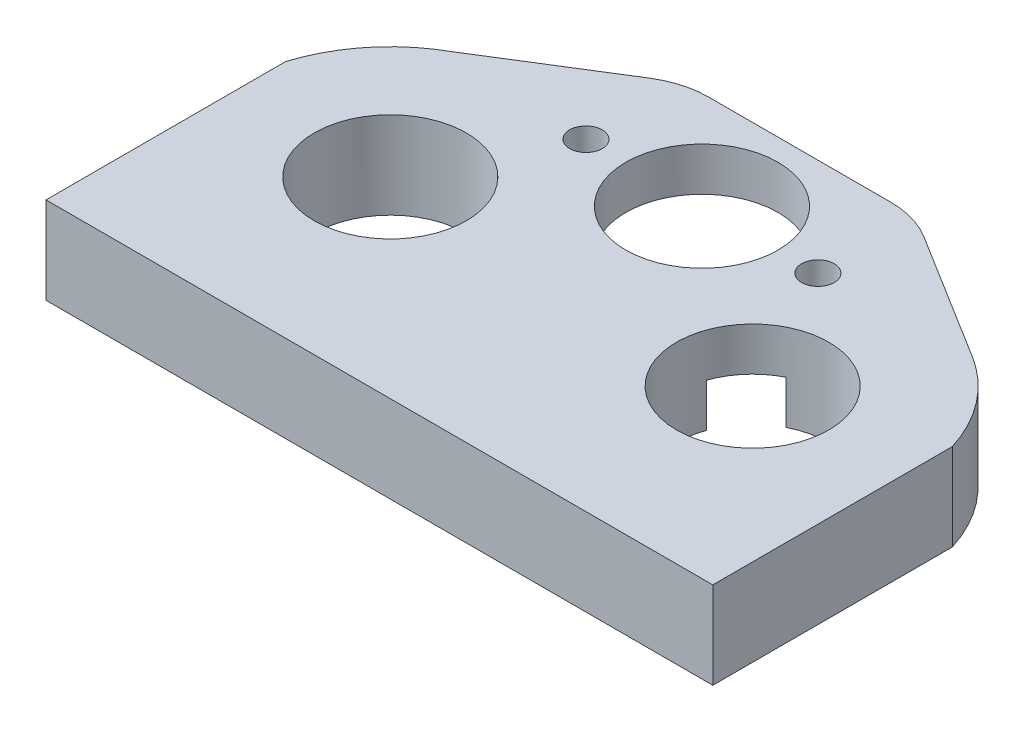
ISO-10303-21;
HEADER;
FILE_DESCRIPTION(('STEP AP214'),'2;1');
FILE_NAME('part.step','',(''),(''),'','','');
FILE_SCHEMA(('AUTOMOTIVE_DESIGN { 1 0 10303 214 1 1 1 1 }'));
ENDSEC;
DATA;
#1=APPLICATION_CONTEXT('core data for automotive mechanical design processes');
#2=APPLICATION_PROTOCOL_DEFINITION('international standard','automotive_design',2000,#1);
#3=PRODUCT_CONTEXT('',#1,'mechanical');
#4=PRODUCT('Part','Part','',(#3));
#5=PRODUCT_RELATED_PRODUCT_CATEGORY('part','',(#4));
#6=PRODUCT_DEFINITION_FORMATION('','',#4);
#7=PRODUCT_DEFINITION_CONTEXT('part definition',#1,'design');
#8=PRODUCT_DEFINITION('design','',#6,#7);
#9=PRODUCT_DEFINITION_SHAPE('','',#8);
#10=(LENGTH_UNIT() NAMED_UNIT(*) SI_UNIT(.MILLI.,.METRE.));
#11=(NAMED_UNIT(*) PLANE_ANGLE_UNIT() SI_UNIT($,.RADIAN.));
#12=(NAMED_UNIT(*) SI_UNIT($,.STERADIAN.) SOLID_ANGLE_UNIT());
#13=UNCERTAINTY_MEASURE_WITH_UNIT(LENGTH_MEASURE(1.E-05),#10,'distance_accuracy_value','');
#14=(GEOMETRIC_REPRESENTATION_CONTEXT(3) GLOBAL_UNCERTAINTY_ASSIGNED_CONTEXT((#13)) GLOBAL_UNIT_ASSIGNED_CONTEXT((#10,
#11,#12)) REPRESENTATION_CONTEXT('',''));
#15=CARTESIAN_POINT('',(0.,0.,0.));
#16=DIRECTION('',(0.,0.,1.));
#17=DIRECTION('',(1.,0.,0.));
#18=AXIS2_PLACEMENT_3D('',#15,#16,#17);
#19=CARTESIAN_POINT('',(-46.,0.,-30.));
#20=DIRECTION('',(0.,0.,-1.));
#21=DIRECTION('',(-1.,0.,0.));
#22=AXIS2_PLACEMENT_3D('',#19,#20,#21);
#23=PLANE('',#22);
#24=DIRECTION('',(0.,1.,0.));
#25=VECTOR('',#24,1.);
#26=CARTESIAN_POINT('',(12.5739501634669,0.,-30.));
#27=LINE('',#26,#25);
#28=CARTESIAN_POINT('',(12.5739501634669,12.,-30.));
#29=VERTEX_POINT('',#28);
#30=CARTESIAN_POINT('',(12.5739501634669,6.,-30.));
#31=VERTEX_POINT('',#30);
#32=EDGE_CURVE('E289',#29,#31,#27,.F.);
#33=ORIENTED_EDGE('',*,*,#32,.T.);
#34=DIRECTION('',(-1.,0.,0.));
#35=VECTOR('',#34,1.);
#36=CARTESIAN_POINT('',(-46.,6.,-30.));
#37=LINE('',#36,#35);
#38=CARTESIAN_POINT('',(-12.56625423062,6.,-30.));
#39=VERTEX_POINT('',#38);
#40=EDGE_CURVE('E205',#31,#39,#37,.T.);
#41=ORIENTED_EDGE('',*,*,#40,.T.);
#42=DIRECTION('',(0.,1.,0.));
#43=VECTOR('',#42,1.);
#44=CARTESIAN_POINT('',(-12.56625423062,12.,-30.));
#45=LINE('',#44,#43);
#46=CARTESIAN_POINT('',(-12.56625423062,12.,-30.));
#47=VERTEX_POINT('',#46);
#48=EDGE_CURVE('E287',#39,#47,#45,.T.);
#49=ORIENTED_EDGE('',*,*,#48,.T.);
#50=DIRECTION('',(-1.,0.,0.));
#51=VECTOR('',#50,1.);
#52=CARTESIAN_POINT('',(-46.,12.,-30.));
#53=LINE('',#52,#51);
#54=EDGE_CURVE('E260',#29,#47,#53,.T.);
#55=ORIENTED_EDGE('',*,*,#54,.F.);
#56=EDGE_LOOP('',(#33,#41,#49,#55));
#57=FACE_BOUND('',#56,.T.);
#58=ADVANCED_FACE('F33',(#57),#23,.T.);
#59=CARTESIAN_POINT('',(12.5739501634669,-0.000999999999999265,-18.));
#60=DIRECTION('',(0.,-1.,0.));
#61=DIRECTION('',(0.,0.,-1.));
#62=AXIS2_PLACEMENT_3D('',#59,#60,#61);
#63=CYLINDRICAL_SURFACE('',#62,12.);
#64=DIRECTION('',(0.,1.,0.));
#65=VECTOR('',#64,1.);
#66=CARTESIAN_POINT('',(18.9096133239769,12.,-28.1911418553838));
#67=LINE('',#66,#65);
#68=CARTESIAN_POINT('',(18.9096133239769,6.,-28.1911418553838));
#69=VERTEX_POINT('',#68);
#70=CARTESIAN_POINT('',(18.9096133239769,12.,-28.1911418553838));
#71=VERTEX_POINT('',#70);
#72=EDGE_CURVE('E282',#69,#71,#67,.T.);
#73=ORIENTED_EDGE('',*,*,#72,.F.);
#74=CARTESIAN_POINT('',(12.5739501634669,6.,-18.));
#75=DIRECTION('',(0.,-1.,0.));
#76=DIRECTION('',(0.,0.,-1.));
#77=AXIS2_PLACEMENT_3D('',#74,#75,#76);
#78=CIRCLE('',#77,12.);
#79=EDGE_CURVE('E208',#69,#31,#78,.F.);
#80=ORIENTED_EDGE('',*,*,#79,.T.);
#81=ORIENTED_EDGE('',*,*,#32,.F.);
#82=CARTESIAN_POINT('',(12.5739501634669,12.,-18.));
#83=DIRECTION('',(0.,1.,0.));
#84=DIRECTION('',(0.,0.,1.));
#85=AXIS2_PLACEMENT_3D('',#82,#83,#84);
#86=CIRCLE('',#85,12.);
#87=EDGE_CURVE('E285',#71,#29,#86,.T.);
#88=ORIENTED_EDGE('',*,*,#87,.F.);
#89=EDGE_LOOP('',(#73,#80,#81,#88));
#90=FACE_BOUND('',#89,.T.);
#91=ADVANCED_FACE('F333',(#90),#63,.T.);
#92=CARTESIAN_POINT('',(-12.56625423062,0.,-18.));
#93=DIRECTION('',(0.,-1.,0.));
#94=DIRECTION('',(0.,0.,-1.));
#95=AXIS2_PLACEMENT_3D('',#92,#93,#94);
#96=CYLINDRICAL_SURFACE('',#95,12.);
#97=ORIENTED_EDGE('',*,*,#48,.F.);
#98=CARTESIAN_POINT('',(-12.56625423062,6.,-18.));
#99=DIRECTION('',(0.,-1.,0.));
#100=DIRECTION('',(0.,0.,-1.));
#101=AXIS2_PLACEMENT_3D('',#98,#99,#100);
#102=CIRCLE('',#101,12.);
#103=CARTESIAN_POINT('',(-18.9139974067074,6.,-28.183621977));
#104=VERTEX_POINT('',#103);
#105=EDGE_CURVE('E295',#39,#104,#102,.F.);
#106=ORIENTED_EDGE('',*,*,#105,.T.);
#107=DIRECTION('',(0.,1.,0.));
#108=VECTOR('',#107,1.);
#109=CARTESIAN_POINT('',(-18.9139974067074,0.,-28.183621977));
#110=LINE('',#109,#108);
#111=CARTESIAN_POINT('',(-18.9139974067074,12.,-28.183621977));
#112=VERTEX_POINT('',#111);
#113=EDGE_CURVE('E292',#112,#104,#110,.F.);
#114=ORIENTED_EDGE('',*,*,#113,.F.);
#115=CARTESIAN_POINT('',(-12.56625423062,12.,-18.));
#116=DIRECTION('',(0.,1.,0.));
#117=DIRECTION('',(0.,0.,1.));
#118=AXIS2_PLACEMENT_3D('',#115,#116,#117);
#119=CIRCLE('',#118,12.);
#120=EDGE_CURVE('E56',#47,#112,#119,.T.);
#121=ORIENTED_EDGE('',*,*,#120,.F.);
#122=EDGE_LOOP('',(#97,#106,#114,#121));
#123=FACE_BOUND('',#122,.T.);
#124=ADVANCED_FACE('F35',(#123),#96,.T.);
#125=CARTESIAN_POINT('',(46.,12.,-28.));
#126=DIRECTION('',(-1.,0.,0.));
#127=DIRECTION('',(0.,0.,1.));
#128=AXIS2_PLACEMENT_3D('',#125,#126,#127);
#129=PLANE('',#128);
#130=DIRECTION('',(0.,0.,-1.));
#131=VECTOR('',#130,1.);
#132=CARTESIAN_POINT('',(46.,0.,-28.));
#133=LINE('',#132,#131);
#134=CARTESIAN_POINT('',(46.,0.,28.));
#135=VERTEX_POINT('',#134);
#136=CARTESIAN_POINT('',(46.,0.,-5.05743852430174));
#137=VERTEX_POINT('',#136);
#138=EDGE_CURVE('E262',#135,#137,#133,.T.);
#139=ORIENTED_EDGE('',*,*,#138,.T.);
#140=DIRECTION('',(0.,1.,0.));
#141=VECTOR('',#140,1.);
#142=CARTESIAN_POINT('',(46.,-0.000999999999999265,-5.05743852430174));
#143=LINE('',#142,#141);
#144=CARTESIAN_POINT('',(46.,12.,-5.05743852430174));
#145=VERTEX_POINT('',#144);
#146=EDGE_CURVE('E229',#137,#145,#143,.T.);
#147=ORIENTED_EDGE('',*,*,#146,.T.);
#148=DIRECTION('',(0.,0.,-1.));
#149=VECTOR('',#148,1.);
#150=CARTESIAN_POINT('',(46.,12.,-28.));
#151=LINE('',#150,#149);
#152=CARTESIAN_POINT('',(46.,12.,28.));
#153=VERTEX_POINT('',#152);
#154=EDGE_CURVE('E263',#153,#145,#151,.T.);
#155=ORIENTED_EDGE('',*,*,#154,.F.);
#156=DIRECTION('',(0.,-1.,0.));
#157=VECTOR('',#156,1.);
#158=CARTESIAN_POINT('',(46.,12.,28.));
#159=LINE('',#158,#157);
#160=EDGE_CURVE('E271',#153,#135,#159,.T.);
#161=ORIENTED_EDGE('',*,*,#160,.T.);
#162=EDGE_LOOP('',(#139,#147,#155,#161));
#163=FACE_BOUND('',#162,.T.);
#164=ADVANCED_FACE('F348',(#163),#129,.F.);
#165=CARTESIAN_POINT('',(-46.,12.,-28.));
#166=DIRECTION('',(1.,0.,0.));
#167=DIRECTION('',(0.,0.,-1.));
#168=AXIS2_PLACEMENT_3D('',#165,#166,#167);
#169=PLANE('',#168);
#170=DIRECTION('',(0.,0.,1.));
#171=VECTOR('',#170,1.);
#172=CARTESIAN_POINT('',(-46.,12.,-28.));
#173=LINE('',#172,#171);
#174=CARTESIAN_POINT('',(-46.,12.,-5.05743852430096));
#175=VERTEX_POINT('',#174);
#176=CARTESIAN_POINT('',(-46.,12.,28.));
#177=VERTEX_POINT('',#176);
#178=EDGE_CURVE('E266',#175,#177,#173,.T.);
#179=ORIENTED_EDGE('',*,*,#178,.F.);
#180=DIRECTION('',(0.,1.,0.));
#181=VECTOR('',#180,1.);
#182=CARTESIAN_POINT('',(-46.,-0.000999999999999265,-5.05743852430096));
#183=LINE('',#182,#181);
#184=CARTESIAN_POINT('',(-46.,0.,-5.05743852430096));
#185=VERTEX_POINT('',#184);
#186=EDGE_CURVE('E243',#185,#175,#183,.T.);
#187=ORIENTED_EDGE('',*,*,#186,.F.);
#188=DIRECTION('',(0.,0.,1.));
#189=VECTOR('',#188,1.);
#190=CARTESIAN_POINT('',(-46.,0.,-28.));
#191=LINE('',#190,#189);
#192=CARTESIAN_POINT('',(-46.,0.,28.));
#193=VERTEX_POINT('',#192);
#194=EDGE_CURVE('E274',#185,#193,#191,.T.);
#195=ORIENTED_EDGE('',*,*,#194,.T.);
#196=DIRECTION('',(0.,-1.,0.));
#197=VECTOR('',#196,1.);
#198=CARTESIAN_POINT('',(-46.,12.,28.));
#199=LINE('',#198,#197);
#200=EDGE_CURVE('E279',#177,#193,#199,.T.);
#201=ORIENTED_EDGE('',*,*,#200,.F.);
#202=EDGE_LOOP('',(#179,#187,#195,#201));
#203=FACE_BOUND('',#202,.T.);
#204=ADVANCED_FACE('F359',(#203),#169,.F.);
#205=CARTESIAN_POINT('',(-46.,12.,28.));
#206=DIRECTION('',(0.,0.,-1.));
#207=DIRECTION('',(-1.,0.,0.));
#208=AXIS2_PLACEMENT_3D('',#205,#206,#207);
#209=PLANE('',#208);
#210=DIRECTION('',(1.,0.,0.));
#211=VECTOR('',#210,1.);
#212=CARTESIAN_POINT('',(-46.,0.,28.));
#213=LINE('',#212,#211);
#214=EDGE_CURVE('E267',#193,#135,#213,.T.);
#215=ORIENTED_EDGE('',*,*,#214,.T.);
#216=ORIENTED_EDGE('',*,*,#160,.F.);
#217=DIRECTION('',(1.,0.,0.));
#218=VECTOR('',#217,1.);
#219=CARTESIAN_POINT('',(-46.,12.,28.));
#220=LINE('',#219,#218);
#221=EDGE_CURVE('E269',#177,#153,#220,.T.);
#222=ORIENTED_EDGE('',*,*,#221,.F.);
#223=ORIENTED_EDGE('',*,*,#200,.T.);
#224=EDGE_LOOP('',(#215,#216,#222,#223));
#225=FACE_BOUND('',#224,.T.);
#226=ADVANCED_FACE('F353',(#225),#209,.F.);
#227=CARTESIAN_POINT('',(46.,12.,28.));
#228=DIRECTION('',(0.,1.,0.));
#229=DIRECTION('',(0.,0.,1.));
#230=AXIS2_PLACEMENT_3D('',#227,#228,#229);
#231=PLANE('',#230);
#232=CARTESIAN_POINT('',(0.,12.,-16.5));
#233=DIRECTION('',(0.,1.,0.));
#234=DIRECTION('',(0.,0.,1.));
#235=AXIS2_PLACEMENT_3D('',#232,#233,#234);
#236=CIRCLE('',#235,10.5);
#237=CARTESIAN_POINT('',(0.,12.,-5.99999999999999));
#238=VERTEX_POINT('',#237);
#239=EDGE_CURVE('E513',#238,#238,#236,.F.);
#240=ORIENTED_EDGE('',*,*,#239,.T.);
#241=EDGE_LOOP('',(#240));
#242=FACE_BOUND('',#241,.T.);
#243=CARTESIAN_POINT('',(-16.,12.,-16.5));
#244=DIRECTION('',(0.,1.,0.));
#245=DIRECTION('',(0.,0.,1.));
#246=AXIS2_PLACEMENT_3D('',#243,#244,#245);
#247=CIRCLE('',#246,2.25);
#248=CARTESIAN_POINT('',(-16.,12.,-14.25));
#249=VERTEX_POINT('',#248);
#250=EDGE_CURVE('E523',#249,#249,#247,.F.);
#251=ORIENTED_EDGE('',*,*,#250,.T.);
#252=EDGE_LOOP('',(#251));
#253=FACE_BOUND('',#252,.T.);
#254=CARTESIAN_POINT('',(16.,12.,-16.5));
#255=DIRECTION('',(0.,1.,0.));
#256=DIRECTION('',(0.,0.,1.));
#257=AXIS2_PLACEMENT_3D('',#254,#255,#256);
#258=CIRCLE('',#257,2.25);
#259=CARTESIAN_POINT('',(16.,12.,-14.25));
#260=VERTEX_POINT('',#259);
#261=EDGE_CURVE('E190',#260,#260,#258,.F.);
#262=ORIENTED_EDGE('',*,*,#261,.T.);
#263=EDGE_LOOP('',(#262));
#264=FACE_BOUND('',#263,.T.);
#265=DIRECTION('',(0.849261821281983,0.,0.527971930042506));
#266=VECTOR('',#265,1.);
#267=CARTESIAN_POINT('',(16.,12.,-30.));
#268=LINE('',#267,#266);
#269=CARTESIAN_POINT('',(36.6153824609372,12.,-17.1837600682023));
#270=VERTEX_POINT('',#269);
#271=EDGE_CURVE('E227',#71,#270,#268,.T.);
#272=ORIENTED_EDGE('',*,*,#271,.F.);
#273=ORIENTED_EDGE('',*,*,#87,.T.);
#274=ORIENTED_EDGE('',*,*,#54,.T.);
#275=ORIENTED_EDGE('',*,*,#120,.T.);
#276=DIRECTION('',(0.848635164749995,0.,-0.52897859800728));
#277=VECTOR('',#276,1.);
#278=CARTESIAN_POINT('',(-16.,12.,-30.));
#279=LINE('',#278,#277);
#280=CARTESIAN_POINT('',(-35.6673041084861,12.,-17.740806195611));
#281=VERTEX_POINT('',#280);
#282=EDGE_CURVE('E240',#281,#112,#279,.T.);
#283=ORIENTED_EDGE('',*,*,#282,.F.);
#284=CARTESIAN_POINT('',(-25.,12.,1.5));
#285=DIRECTION('',(0.,-1.,0.));
#286=DIRECTION('',(0.,0.,-1.));
#287=AXIS2_PLACEMENT_3D('',#284,#285,#286);
#288=CIRCLE('',#287,21.9999999999997);
#289=EDGE_CURVE('E237',#175,#281,#288,.T.);
#290=ORIENTED_EDGE('',*,*,#289,.F.);
#291=ORIENTED_EDGE('',*,*,#178,.T.);
#292=ORIENTED_EDGE('',*,*,#221,.T.);
#293=ORIENTED_EDGE('',*,*,#154,.T.);
#294=CARTESIAN_POINT('',(25.,12.,1.5));
#295=DIRECTION('',(0.,-1.,0.));
#296=DIRECTION('',(0.,0.,1.));
#297=AXIS2_PLACEMENT_3D('',#294,#295,#296);
#298=CIRCLE('',#297,21.9999999999999);
#299=EDGE_CURVE('E225',#270,#145,#298,.T.);
#300=ORIENTED_EDGE('',*,*,#299,.F.);
#301=EDGE_LOOP('',(#272,#273,#274,#275,#283,#290,#291,#292,#293,#300));
#302=FACE_BOUND('',#301,.T.);
#303=CARTESIAN_POINT('',(25.,12.,1.5));
#304=DIRECTION('',(0.,1.,0.));
#305=DIRECTION('',(0.,0.,1.));
#306=AXIS2_PLACEMENT_3D('',#303,#304,#305);
#307=CIRCLE('',#306,10.5);
#308=CARTESIAN_POINT('',(25.,12.,12.));
#309=VERTEX_POINT('',#308);
#310=EDGE_CURVE('E248',#309,#309,#307,.T.);
#311=ORIENTED_EDGE('',*,*,#310,.F.);
#312=EDGE_LOOP('',(#311));
#313=FACE_BOUND('',#312,.T.);
#314=CARTESIAN_POINT('',(-25.,12.,1.5));
#315=DIRECTION('',(0.,1.,0.));
#316=DIRECTION('',(0.,0.,1.));
#317=AXIS2_PLACEMENT_3D('',#314,#315,#316);
#318=CIRCLE('',#317,10.5);
#319=CARTESIAN_POINT('',(-25.,12.,12.));
#320=VERTEX_POINT('',#319);
#321=EDGE_CURVE('E254',#320,#320,#318,.T.);
#322=ORIENTED_EDGE('',*,*,#321,.F.);
#323=EDGE_LOOP('',(#322));
#324=FACE_BOUND('',#323,.T.);
#325=ADVANCED_FACE('F363',(#242,#253,#264,#302,#313,#324),#231,.T.);
#326=CARTESIAN_POINT('',(46.,0.,28.));
#327=DIRECTION('',(0.,1.,0.));
#328=DIRECTION('',(0.,0.,1.));
#329=AXIS2_PLACEMENT_3D('',#326,#327,#328);
#330=PLANE('',#329);
#331=CARTESIAN_POINT('',(25.,0.,1.5));
#332=DIRECTION('',(0.,1.,0.));
#333=DIRECTION('',(0.,0.,1.));
#334=AXIS2_PLACEMENT_3D('',#331,#332,#333);
#335=CIRCLE('',#334,10.5);
#336=CARTESIAN_POINT('',(20.2297972397528,0.,-7.85388505521263));
#337=VERTEX_POINT('',#336);
#338=CARTESIAN_POINT('',(15.1005050633883,0.,-2.));
#339=VERTEX_POINT('',#338);
#340=EDGE_CURVE('E251',#337,#339,#335,.F.);
#341=ORIENTED_EDGE('',*,*,#340,.F.);
#342=CARTESIAN_POINT('',(0.,0.,-16.5));
#343=DIRECTION('',(0.,-1.,0.));
#344=DIRECTION('',(0.,0.,-1.));
#345=AXIS2_PLACEMENT_3D('',#342,#343,#344);
#346=CIRCLE('',#345,21.9999999999997);
#347=CARTESIAN_POINT('',(21.9999999999997,0.,-16.5));
#348=VERTEX_POINT('',#347);
#349=EDGE_CURVE('E187',#348,#337,#346,.T.);
#350=ORIENTED_EDGE('',*,*,#349,.F.);
#351=DIRECTION('',(0.,0.,1.));
#352=VECTOR('',#351,1.);
#353=CARTESIAN_POINT('',(21.9999999999997,0.,-16.5));
#354=LINE('',#353,#352);
#355=CARTESIAN_POINT('',(21.9999999999997,0.,-26.2698999285368));
#356=VERTEX_POINT('',#355);
#357=EDGE_CURVE('E195',#356,#348,#354,.T.);
#358=ORIENTED_EDGE('',*,*,#357,.F.);
#359=DIRECTION('',(-0.849261821281983,0.,-0.527971930042506));
#360=VECTOR('',#359,1.);
#361=CARTESIAN_POINT('',(16.,0.,-30.));
#362=LINE('',#361,#360);
#363=CARTESIAN_POINT('',(36.6153824609372,0.,-17.1837600682023));
#364=VERTEX_POINT('',#363);
#365=EDGE_CURVE('E219',#364,#356,#362,.T.);
#366=ORIENTED_EDGE('',*,*,#365,.F.);
#367=CARTESIAN_POINT('',(25.,0.,1.5));
#368=DIRECTION('',(0.,1.,0.));
#369=DIRECTION('',(0.,0.,1.));
#370=AXIS2_PLACEMENT_3D('',#367,#368,#369);
#371=CIRCLE('',#370,21.9999999999999);
#372=EDGE_CURVE('E222',#137,#364,#371,.T.);
#373=ORIENTED_EDGE('',*,*,#372,.F.);
#374=ORIENTED_EDGE('',*,*,#138,.F.);
#375=ORIENTED_EDGE('',*,*,#214,.F.);
#376=ORIENTED_EDGE('',*,*,#194,.F.);
#377=CARTESIAN_POINT('',(-25.,0.,1.5));
#378=DIRECTION('',(0.,1.,0.));
#379=DIRECTION('',(0.,0.,1.));
#380=AXIS2_PLACEMENT_3D('',#377,#378,#379);
#381=CIRCLE('',#380,21.9999999999997);
#382=CARTESIAN_POINT('',(-35.6673041084861,0.,-17.740806195611));
#383=VERTEX_POINT('',#382);
#384=EDGE_CURVE('E233',#383,#185,#381,.T.);
#385=ORIENTED_EDGE('',*,*,#384,.F.);
#386=DIRECTION('',(-0.848635164749996,0.,0.52897859800728));
#387=VECTOR('',#386,1.);
#388=CARTESIAN_POINT('',(-16.,0.,-30.));
#389=LINE('',#388,#387);
#390=CARTESIAN_POINT('',(-21.9999999999997,0.,-26.2600281960051));
#391=VERTEX_POINT('',#390);
#392=EDGE_CURVE('E245',#391,#383,#389,.T.);
#393=ORIENTED_EDGE('',*,*,#392,.F.);
#394=DIRECTION('',(0.,0.,-1.));
#395=VECTOR('',#394,1.);
#396=CARTESIAN_POINT('',(-21.9999999999997,0.,-16.5));
#397=LINE('',#396,#395);
#398=CARTESIAN_POINT('',(-21.9999999999997,0.,-16.5));
#399=VERTEX_POINT('',#398);
#400=EDGE_CURVE('E193',#399,#391,#397,.T.);
#401=ORIENTED_EDGE('',*,*,#400,.F.);
#402=CARTESIAN_POINT('',(0.,0.,-16.5));
#403=DIRECTION('',(0.,-1.,0.));
#404=DIRECTION('',(0.,0.,-1.));
#405=AXIS2_PLACEMENT_3D('',#402,#403,#404);
#406=CIRCLE('',#405,21.9999999999997);
#407=CARTESIAN_POINT('',(-20.2297972397528,0.,-7.85388505521263));
#408=VERTEX_POINT('',#407);
#409=EDGE_CURVE('E174',#408,#399,#406,.T.);
#410=ORIENTED_EDGE('',*,*,#409,.F.);
#411=CARTESIAN_POINT('',(-25.,0.,1.5));
#412=DIRECTION('',(0.,1.,0.));
#413=DIRECTION('',(0.,0.,1.));
#414=AXIS2_PLACEMENT_3D('',#411,#412,#413);
#415=CIRCLE('',#414,10.5);
#416=CARTESIAN_POINT('',(-15.1005050633883,0.,-2.));
#417=VERTEX_POINT('',#416);
#418=EDGE_CURVE('E257',#417,#408,#415,.F.);
#419=ORIENTED_EDGE('',*,*,#418,.F.);
#420=DIRECTION('',(-1.,0.,0.));
#421=VECTOR('',#420,1.);
#422=CARTESIAN_POINT('',(-16.5453921077739,0.,-2.));
#423=LINE('',#422,#421);
#424=EDGE_CURVE('E189',#339,#417,#423,.T.);
#425=ORIENTED_EDGE('',*,*,#424,.F.);
#426=EDGE_LOOP('',(#341,#350,#358,#366,#373,#374,#375,#376,#385,#393,#401,#410,#419,#425));
#427=FACE_BOUND('',#426,.T.);
#428=ADVANCED_FACE('F310',(#427),#330,.F.);
#429=CARTESIAN_POINT('',(-25.,-0.000999999999999265,1.5));
#430=DIRECTION('',(0.,1.,0.));
#431=DIRECTION('',(0.,0.,1.));
#432=AXIS2_PLACEMENT_3D('',#429,#430,#431);
#433=CYLINDRICAL_SURFACE('',#432,10.5);
#434=ORIENTED_EDGE('',*,*,#418,.T.);
#435=DIRECTION('',(0.,-1.,0.));
#436=VECTOR('',#435,1.);
#437=CARTESIAN_POINT('',(-20.2297972397528,3.,-7.85388505521264));
#438=LINE('',#437,#436);
#439=CARTESIAN_POINT('',(-20.2297972397528,6.,-7.85388505521263));
#440=VERTEX_POINT('',#439);
#441=EDGE_CURVE('E11',#408,#440,#438,.F.);
#442=ORIENTED_EDGE('',*,*,#441,.T.);
#443=CARTESIAN_POINT('',(-25.,6.,1.5));
#444=DIRECTION('',(0.,-1.,0.));
#445=DIRECTION('',(0.,0.,-1.));
#446=AXIS2_PLACEMENT_3D('',#443,#444,#445);
#447=CIRCLE('',#446,10.5);
#448=CARTESIAN_POINT('',(-15.1005050633883,6.,-2.));
#449=VERTEX_POINT('',#448);
#450=EDGE_CURVE('E166',#449,#440,#447,.F.);
#451=ORIENTED_EDGE('',*,*,#450,.F.);
#452=DIRECTION('',(0.,1.,0.));
#453=VECTOR('',#452,1.);
#454=CARTESIAN_POINT('',(-15.1005050633883,-0.000999999999999265,-2.));
#455=LINE('',#454,#453);
#456=EDGE_CURVE('E216',#449,#417,#455,.F.);
#457=ORIENTED_EDGE('',*,*,#456,.T.);
#458=EDGE_LOOP('',(#434,#442,#451,#457));
#459=FACE_BOUND('',#458,.T.);
#460=ORIENTED_EDGE('',*,*,#321,.T.);
#461=EDGE_LOOP('',(#460));
#462=FACE_BOUND('',#461,.T.);
#463=ADVANCED_FACE('F317',(#459,#462),#433,.F.);
#464=CARTESIAN_POINT('',(25.,-0.000999999999999265,1.5));
#465=DIRECTION('',(0.,1.,0.));
#466=DIRECTION('',(0.,0.,1.));
#467=AXIS2_PLACEMENT_3D('',#464,#465,#466);
#468=CYLINDRICAL_SURFACE('',#467,10.5);
#469=ORIENTED_EDGE('',*,*,#310,.T.);
#470=EDGE_LOOP('',(#469));
#471=FACE_BOUND('',#470,.T.);
#472=CARTESIAN_POINT('',(25.,6.,1.5));
#473=DIRECTION('',(0.,-1.,0.));
#474=DIRECTION('',(0.,0.,-1.));
#475=AXIS2_PLACEMENT_3D('',#472,#473,#474);
#476=CIRCLE('',#475,10.5);
#477=CARTESIAN_POINT('',(20.2297972397528,6.,-7.85388505521263));
#478=VERTEX_POINT('',#477);
#479=CARTESIAN_POINT('',(15.1005050633883,6.,-2.));
#480=VERTEX_POINT('',#479);
#481=EDGE_CURVE('E213',#478,#480,#476,.F.);
#482=ORIENTED_EDGE('',*,*,#481,.F.);
#483=DIRECTION('',(0.,-1.,0.));
#484=VECTOR('',#483,1.);
#485=CARTESIAN_POINT('',(20.2297972397528,3.,-7.85388505521262));
#486=LINE('',#485,#484);
#487=EDGE_CURVE('E41',#478,#337,#486,.T.);
#488=ORIENTED_EDGE('',*,*,#487,.T.);
#489=ORIENTED_EDGE('',*,*,#340,.T.);
#490=DIRECTION('',(0.,1.,0.));
#491=VECTOR('',#490,1.);
#492=CARTESIAN_POINT('',(15.1005050633883,-0.000999999999999265,-2.));
#493=LINE('',#492,#491);
#494=EDGE_CURVE('E297',#339,#480,#493,.T.);
#495=ORIENTED_EDGE('',*,*,#494,.T.);
#496=EDGE_LOOP('',(#482,#488,#489,#495));
#497=FACE_BOUND('',#496,.T.);
#498=ADVANCED_FACE('F303',(#471,#497),#468,.F.);
#499=CARTESIAN_POINT('',(-25.,-0.000999999999999265,1.5));
#500=DIRECTION('',(0.,1.,0.));
#501=DIRECTION('',(0.,0.,1.));
#502=AXIS2_PLACEMENT_3D('',#499,#500,#501);
#503=CYLINDRICAL_SURFACE('',#502,21.9999999999997);
#504=ORIENTED_EDGE('',*,*,#384,.T.);
#505=ORIENTED_EDGE('',*,*,#186,.T.);
#506=ORIENTED_EDGE('',*,*,#289,.T.);
#507=DIRECTION('',(0.,1.,0.));
#508=VECTOR('',#507,1.);
#509=CARTESIAN_POINT('',(-35.6673041084861,-0.000999999999999265,-17.740806195611));
#510=LINE('',#509,#508);
#511=EDGE_CURVE('E242',#383,#281,#510,.T.);
#512=ORIENTED_EDGE('',*,*,#511,.F.);
#513=EDGE_LOOP('',(#504,#505,#506,#512));
#514=FACE_BOUND('',#513,.T.);
#515=ADVANCED_FACE('F362',(#514),#503,.T.);
#516=CARTESIAN_POINT('',(-16.,-0.000999999999999265,-30.));
#517=DIRECTION('',(0.52897859800728,0.,0.848635164749996));
#518=DIRECTION('',(0.848635164749996,0.,-0.52897859800728));
#519=AXIS2_PLACEMENT_3D('',#516,#517,#518);
#520=PLANE('',#519);
#521=DIRECTION('',(0.848635164749996,0.,-0.52897859800728));
#522=VECTOR('',#521,1.);
#523=CARTESIAN_POINT('',(-16.,6.,-30.));
#524=LINE('',#523,#522);
#525=CARTESIAN_POINT('',(-21.9999999999997,6.,-26.2600281960051));
#526=VERTEX_POINT('',#525);
#527=EDGE_CURVE('E48',#526,#104,#524,.T.);
#528=ORIENTED_EDGE('',*,*,#527,.F.);
#529=DIRECTION('',(0.,-1.,0.));
#530=VECTOR('',#529,1.);
#531=CARTESIAN_POINT('',(-21.9999999999997,6.,-26.2600281960051));
#532=LINE('',#531,#530);
#533=EDGE_CURVE('E177',#526,#391,#532,.T.);
#534=ORIENTED_EDGE('',*,*,#533,.T.);
#535=ORIENTED_EDGE('',*,*,#392,.T.);
#536=ORIENTED_EDGE('',*,*,#511,.T.);
#537=ORIENTED_EDGE('',*,*,#282,.T.);
#538=ORIENTED_EDGE('',*,*,#113,.T.);
#539=EDGE_LOOP('',(#528,#534,#535,#536,#537,#538));
#540=FACE_BOUND('',#539,.T.);
#541=ADVANCED_FACE('F322',(#540),#520,.F.);
#542=CARTESIAN_POINT('',(25.,-0.000999999999999265,1.5));
#543=DIRECTION('',(0.,1.,0.));
#544=DIRECTION('',(0.,0.,1.));
#545=AXIS2_PLACEMENT_3D('',#542,#543,#544);
#546=CYLINDRICAL_SURFACE('',#545,21.9999999999999);
#547=ORIENTED_EDGE('',*,*,#372,.T.);
#548=DIRECTION('',(0.,1.,0.));
#549=VECTOR('',#548,1.);
#550=CARTESIAN_POINT('',(36.6153824609372,-0.000999999999999265,-17.1837600682023));
#551=LINE('',#550,#549);
#552=EDGE_CURVE('E230',#364,#270,#551,.T.);
#553=ORIENTED_EDGE('',*,*,#552,.T.);
#554=ORIENTED_EDGE('',*,*,#299,.T.);
#555=ORIENTED_EDGE('',*,*,#146,.F.);
#556=EDGE_LOOP('',(#547,#553,#554,#555));
#557=FACE_BOUND('',#556,.T.);
#558=ADVANCED_FACE('F366',(#557),#546,.T.);
#559=CARTESIAN_POINT('',(16.,-0.000999999999999265,-30.));
#560=DIRECTION('',(-0.527971930042506,0.,0.849261821281983));
#561=DIRECTION('',(0.849261821281983,0.,0.527971930042506));
#562=AXIS2_PLACEMENT_3D('',#559,#560,#561);
#563=PLANE('',#562);
#564=ORIENTED_EDGE('',*,*,#365,.T.);
#565=DIRECTION('',(0.,-1.,0.));
#566=VECTOR('',#565,1.);
#567=CARTESIAN_POINT('',(21.9999999999997,6.,-26.2698999285368));
#568=LINE('',#567,#566);
#569=CARTESIAN_POINT('',(21.9999999999997,6.,-26.2698999285368));
#570=VERTEX_POINT('',#569);
#571=EDGE_CURVE('E201',#570,#356,#568,.T.);
#572=ORIENTED_EDGE('',*,*,#571,.F.);
#573=DIRECTION('',(0.849261821281983,0.,0.527971930042506));
#574=VECTOR('',#573,1.);
#575=CARTESIAN_POINT('',(16.,6.,-30.));
#576=LINE('',#575,#574);
#577=EDGE_CURVE('E211',#69,#570,#576,.T.);
#578=ORIENTED_EDGE('',*,*,#577,.F.);
#579=ORIENTED_EDGE('',*,*,#72,.T.);
#580=ORIENTED_EDGE('',*,*,#271,.T.);
#581=ORIENTED_EDGE('',*,*,#552,.F.);
#582=EDGE_LOOP('',(#564,#572,#578,#579,#580,#581));
#583=FACE_BOUND('',#582,.T.);
#584=ADVANCED_FACE('F339',(#583),#563,.F.);
#585=CARTESIAN_POINT('',(0.,6.,-16.5));
#586=DIRECTION('',(0.,-1.,0.));
#587=DIRECTION('',(0.,0.,-1.));
#588=AXIS2_PLACEMENT_3D('',#585,#586,#587);
#589=CYLINDRICAL_SURFACE('',#588,21.9999999999997);
#590=ORIENTED_EDGE('',*,*,#409,.T.);
#591=DIRECTION('',(0.,-1.,0.));
#592=VECTOR('',#591,1.);
#593=CARTESIAN_POINT('',(-21.9999999999997,6.,-16.5));
#594=LINE('',#593,#592);
#595=CARTESIAN_POINT('',(-21.9999999999997,6.,-16.5));
#596=VERTEX_POINT('',#595);
#597=EDGE_CURVE('E171',#596,#399,#594,.T.);
#598=ORIENTED_EDGE('',*,*,#597,.F.);
#599=CARTESIAN_POINT('',(0.,6.,-16.5));
#600=DIRECTION('',(0.,-1.,0.));
#601=DIRECTION('',(0.,0.,-1.));
#602=AXIS2_PLACEMENT_3D('',#599,#600,#601);
#603=CIRCLE('',#602,21.9999999999997);
#604=EDGE_CURVE('E159',#440,#596,#603,.T.);
#605=ORIENTED_EDGE('',*,*,#604,.F.);
#606=ORIENTED_EDGE('',*,*,#441,.F.);
#607=EDGE_LOOP('',(#590,#598,#605,#606));
#608=FACE_BOUND('',#607,.T.);
#609=ADVANCED_FACE('F172',(#608),#589,.F.);
#610=CARTESIAN_POINT('',(0.,6.,-16.5));
#611=DIRECTION('',(0.,-1.,0.));
#612=DIRECTION('',(0.,0.,-1.));
#613=AXIS2_PLACEMENT_3D('',#610,#611,#612);
#614=CYLINDRICAL_SURFACE('',#613,21.9999999999997);
#615=CARTESIAN_POINT('',(0.,6.,-16.5));
#616=DIRECTION('',(0.,-1.,0.));
#617=DIRECTION('',(0.,0.,-1.));
#618=AXIS2_PLACEMENT_3D('',#615,#616,#617);
#619=CIRCLE('',#618,21.9999999999997);
#620=CARTESIAN_POINT('',(21.9999999999997,6.,-16.5));
#621=VERTEX_POINT('',#620);
#622=EDGE_CURVE('E198',#621,#478,#619,.T.);
#623=ORIENTED_EDGE('',*,*,#622,.F.);
#624=DIRECTION('',(0.,-1.,0.));
#625=VECTOR('',#624,1.);
#626=CARTESIAN_POINT('',(21.9999999999997,6.,-16.5));
#627=LINE('',#626,#625);
#628=EDGE_CURVE('E199',#621,#348,#627,.T.);
#629=ORIENTED_EDGE('',*,*,#628,.T.);
#630=ORIENTED_EDGE('',*,*,#349,.T.);
#631=ORIENTED_EDGE('',*,*,#487,.F.);
#632=EDGE_LOOP('',(#623,#629,#630,#631));
#633=FACE_BOUND('',#632,.T.);
#634=ADVANCED_FACE('F433',(#633),#614,.F.);
#635=CARTESIAN_POINT('',(-16.5453921077739,6.,-2.));
#636=DIRECTION('',(0.,0.,1.));
#637=DIRECTION('',(1.,0.,0.));
#638=AXIS2_PLACEMENT_3D('',#635,#636,#637);
#639=PLANE('',#638);
#640=DIRECTION('',(-1.,0.,0.));
#641=VECTOR('',#640,1.);
#642=CARTESIAN_POINT('',(-16.5453921077739,6.,-2.));
#643=LINE('',#642,#641);
#644=EDGE_CURVE('E168',#480,#449,#643,.T.);
#645=ORIENTED_EDGE('',*,*,#644,.F.);
#646=ORIENTED_EDGE('',*,*,#494,.F.);
#647=ORIENTED_EDGE('',*,*,#424,.T.);
#648=ORIENTED_EDGE('',*,*,#456,.F.);
#649=EDGE_LOOP('',(#645,#646,#647,#648));
#650=FACE_BOUND('',#649,.T.);
#651=ADVANCED_FACE('F315',(#650),#639,.F.);
#652=CARTESIAN_POINT('',(0.,6.,-16.5));
#653=DIRECTION('',(0.,-1.,0.));
#654=DIRECTION('',(0.,0.,-1.));
#655=AXIS2_PLACEMENT_3D('',#652,#653,#654);
#656=PLANE('',#655);
#657=CARTESIAN_POINT('',(0.,6.,-16.5));
#658=DIRECTION('',(0.,-1.,0.));
#659=DIRECTION('',(0.,0.,-1.));
#660=AXIS2_PLACEMENT_3D('',#657,#658,#659);
#661=CIRCLE('',#660,10.5);
#662=CARTESIAN_POINT('',(0.,6.,-27.));
#663=VERTEX_POINT('',#662);
#664=EDGE_CURVE('E516',#663,#663,#661,.F.);
#665=ORIENTED_EDGE('',*,*,#664,.T.);
#666=EDGE_LOOP('',(#665));
#667=FACE_BOUND('',#666,.T.);
#668=CARTESIAN_POINT('',(-16.,6.,-16.5));
#669=DIRECTION('',(0.,-1.,0.));
#670=DIRECTION('',(0.,0.,-1.));
#671=AXIS2_PLACEMENT_3D('',#668,#669,#670);
#672=CIRCLE('',#671,2.25);
#673=CARTESIAN_POINT('',(-16.,6.,-18.75));
#674=VERTEX_POINT('',#673);
#675=EDGE_CURVE('E518',#674,#674,#672,.F.);
#676=ORIENTED_EDGE('',*,*,#675,.T.);
#677=EDGE_LOOP('',(#676));
#678=FACE_BOUND('',#677,.T.);
#679=CARTESIAN_POINT('',(16.,6.,-16.5));
#680=DIRECTION('',(0.,-1.,0.));
#681=DIRECTION('',(0.,0.,-1.));
#682=AXIS2_PLACEMENT_3D('',#679,#680,#681);
#683=CIRCLE('',#682,2.25);
#684=CARTESIAN_POINT('',(16.,6.,-18.75));
#685=VERTEX_POINT('',#684);
#686=EDGE_CURVE('E526',#685,#685,#683,.F.);
#687=ORIENTED_EDGE('',*,*,#686,.T.);
#688=EDGE_LOOP('',(#687));
#689=FACE_BOUND('',#688,.T.);
#690=ORIENTED_EDGE('',*,*,#450,.T.);
#691=ORIENTED_EDGE('',*,*,#604,.T.);
#692=DIRECTION('',(0.,0.,-1.));
#693=VECTOR('',#692,1.);
#694=CARTESIAN_POINT('',(-21.9999999999997,6.,-16.5));
#695=LINE('',#694,#693);
#696=EDGE_CURVE('E163',#596,#526,#695,.T.);
#697=ORIENTED_EDGE('',*,*,#696,.T.);
#698=ORIENTED_EDGE('',*,*,#527,.T.);
#699=ORIENTED_EDGE('',*,*,#105,.F.);
#700=ORIENTED_EDGE('',*,*,#40,.F.);
#701=ORIENTED_EDGE('',*,*,#79,.F.);
#702=ORIENTED_EDGE('',*,*,#577,.T.);
#703=DIRECTION('',(0.,0.,1.));
#704=VECTOR('',#703,1.);
#705=CARTESIAN_POINT('',(21.9999999999997,6.,-16.5));
#706=LINE('',#705,#704);
#707=EDGE_CURVE('E178',#570,#621,#706,.T.);
#708=ORIENTED_EDGE('',*,*,#707,.T.);
#709=ORIENTED_EDGE('',*,*,#622,.T.);
#710=ORIENTED_EDGE('',*,*,#481,.T.);
#711=ORIENTED_EDGE('',*,*,#644,.T.);
#712=EDGE_LOOP('',(#690,#691,#697,#698,#699,#700,#701,#702,#708,#709,#710,#711));
#713=FACE_BOUND('',#712,.T.);
#714=ADVANCED_FACE('F161',(#667,#678,#689,#713),#656,.T.);
#715=CARTESIAN_POINT('',(21.9999999999997,6.,-16.5));
#716=DIRECTION('',(1.,0.,0.));
#717=DIRECTION('',(0.,0.,-1.));
#718=AXIS2_PLACEMENT_3D('',#715,#716,#717);
#719=PLANE('',#718);
#720=ORIENTED_EDGE('',*,*,#357,.T.);
#721=ORIENTED_EDGE('',*,*,#628,.F.);
#722=ORIENTED_EDGE('',*,*,#707,.F.);
#723=ORIENTED_EDGE('',*,*,#571,.T.);
#724=EDGE_LOOP('',(#720,#721,#722,#723));
#725=FACE_BOUND('',#724,.T.);
#726=ADVANCED_FACE('F342',(#725),#719,.F.);
#727=CARTESIAN_POINT('',(-21.9999999999997,6.,-16.5));
#728=DIRECTION('',(-1.,0.,0.));
#729=DIRECTION('',(0.,0.,1.));
#730=AXIS2_PLACEMENT_3D('',#727,#728,#729);
#731=PLANE('',#730);
#732=ORIENTED_EDGE('',*,*,#400,.T.);
#733=ORIENTED_EDGE('',*,*,#533,.F.);
#734=ORIENTED_EDGE('',*,*,#696,.F.);
#735=ORIENTED_EDGE('',*,*,#597,.T.);
#736=EDGE_LOOP('',(#732,#733,#734,#735));
#737=FACE_BOUND('',#736,.T.);
#738=ADVANCED_FACE('F180',(#737),#731,.F.);
#739=CARTESIAN_POINT('',(16.,12.001,-16.5));
#740=DIRECTION('',(0.,-1.,0.));
#741=DIRECTION('',(0.,0.,-1.));
#742=AXIS2_PLACEMENT_3D('',#739,#740,#741);
#743=CYLINDRICAL_SURFACE('',#742,2.25);
#744=ORIENTED_EDGE('',*,*,#261,.F.);
#745=EDGE_LOOP('',(#744));
#746=FACE_BOUND('',#745,.T.);
#747=ORIENTED_EDGE('',*,*,#686,.F.);
#748=EDGE_LOOP('',(#747));
#749=FACE_BOUND('',#748,.T.);
#750=ADVANCED_FACE('F468',(#746,#749),#743,.F.);
#751=CARTESIAN_POINT('',(-16.,12.001,-16.5));
#752=DIRECTION('',(0.,-1.,0.));
#753=DIRECTION('',(0.,0.,-1.));
#754=AXIS2_PLACEMENT_3D('',#751,#752,#753);
#755=CYLINDRICAL_SURFACE('',#754,2.25);
#756=ORIENTED_EDGE('',*,*,#250,.F.);
#757=EDGE_LOOP('',(#756));
#758=FACE_BOUND('',#757,.T.);
#759=ORIENTED_EDGE('',*,*,#675,.F.);
#760=EDGE_LOOP('',(#759));
#761=FACE_BOUND('',#760,.T.);
#762=ADVANCED_FACE('F486',(#758,#761),#755,.F.);
#763=CARTESIAN_POINT('',(0.,12.001,-16.5));
#764=DIRECTION('',(0.,-1.,0.));
#765=DIRECTION('',(0.,0.,-1.));
#766=AXIS2_PLACEMENT_3D('',#763,#764,#765);
#767=CYLINDRICAL_SURFACE('',#766,10.5);
#768=ORIENTED_EDGE('',*,*,#239,.F.);
#769=EDGE_LOOP('',(#768));
#770=FACE_BOUND('',#769,.T.);
#771=ORIENTED_EDGE('',*,*,#664,.F.);
#772=EDGE_LOOP('',(#771));
#773=FACE_BOUND('',#772,.T.);
#774=ADVANCED_FACE('F496',(#770,#773),#767,.F.);
#775=CLOSED_SHELL('',(#58,#91,#124,#164,#204,#226,#325,#428,#463,#498,#515,#541,#558,#584,#609,
#634,#651,#714,#726,#738,#750,#762,#774));
#776=MANIFOLD_SOLID_BREP('B2',#775);
#777=ADVANCED_BREP_SHAPE_REPRESENTATION('',(#18,#776),#14);
#778=SHAPE_DEFINITION_REPRESENTATION(#9,#777);
ENDSEC;
END-ISO-10303-21;
